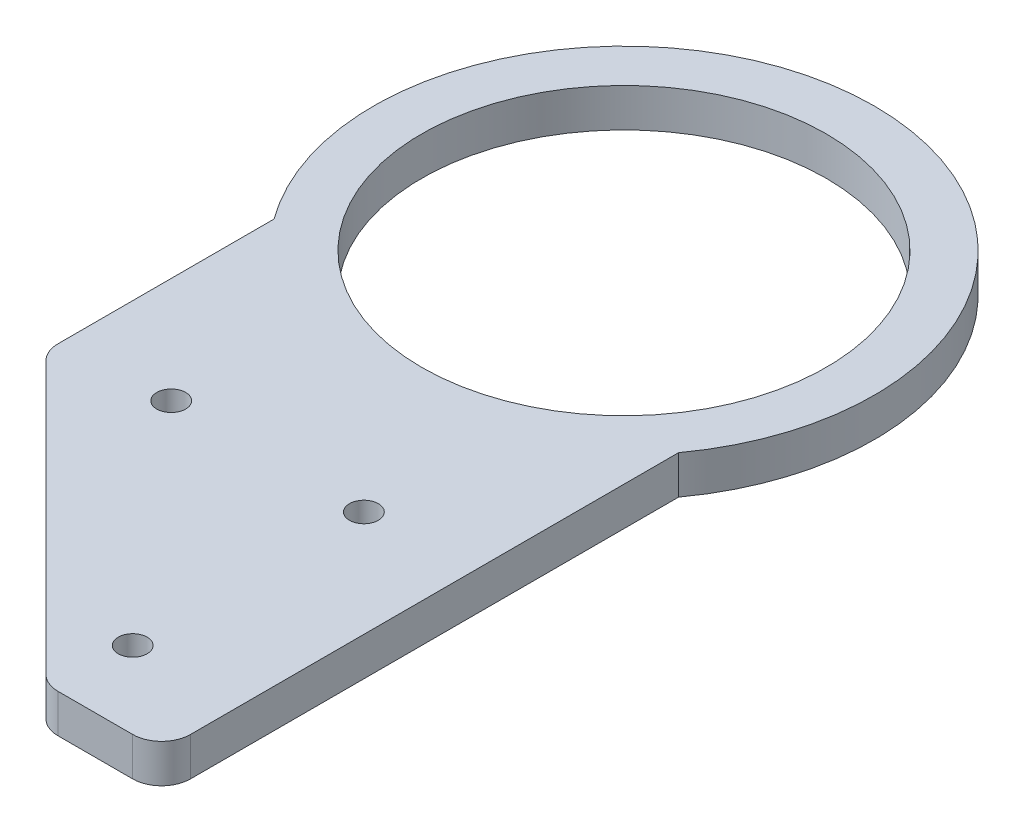
ISO-10303-21;
HEADER;
FILE_DESCRIPTION(('STEP AP214'),'2;1');
FILE_NAME('part.step','',(''),(''),'','','');
FILE_SCHEMA(('AUTOMOTIVE_DESIGN { 1 0 10303 214 1 1 1 1 }'));
ENDSEC;
DATA;
#1=APPLICATION_CONTEXT('core data for automotive mechanical design processes');
#2=APPLICATION_PROTOCOL_DEFINITION('international standard','automotive_design',2000,#1);
#3=PRODUCT_CONTEXT('',#1,'mechanical');
#4=PRODUCT('Part','Part','',(#3));
#5=PRODUCT_RELATED_PRODUCT_CATEGORY('part','',(#4));
#6=PRODUCT_DEFINITION_FORMATION('','',#4);
#7=PRODUCT_DEFINITION_CONTEXT('part definition',#1,'design');
#8=PRODUCT_DEFINITION('design','',#6,#7);
#9=PRODUCT_DEFINITION_SHAPE('','',#8);
#10=(LENGTH_UNIT() NAMED_UNIT(*) SI_UNIT(.MILLI.,.METRE.));
#11=(NAMED_UNIT(*) PLANE_ANGLE_UNIT() SI_UNIT($,.RADIAN.));
#12=(NAMED_UNIT(*) SI_UNIT($,.STERADIAN.) SOLID_ANGLE_UNIT());
#13=UNCERTAINTY_MEASURE_WITH_UNIT(LENGTH_MEASURE(1.E-05),#10,'distance_accuracy_value','');
#14=(GEOMETRIC_REPRESENTATION_CONTEXT(3) GLOBAL_UNCERTAINTY_ASSIGNED_CONTEXT((#13)) GLOBAL_UNIT_ASSIGNED_CONTEXT((#10,
#11,#12)) REPRESENTATION_CONTEXT('',''));
#15=CARTESIAN_POINT('',(0.,0.,0.));
#16=DIRECTION('',(0.,0.,1.));
#17=DIRECTION('',(1.,0.,0.));
#18=AXIS2_PLACEMENT_3D('',#15,#16,#17);
#19=CARTESIAN_POINT('',(80.,0.,0.));
#20=DIRECTION('',(1.,0.,0.));
#21=DIRECTION('',(0.,0.,-1.));
#22=AXIS2_PLACEMENT_3D('',#19,#20,#21);
#23=PLANE('',#22);
#24=DIRECTION('',(0.,0.,-1.));
#25=VECTOR('',#24,1.);
#26=CARTESIAN_POINT('',(80.,0.,0.));
#27=LINE('',#26,#25);
#28=CARTESIAN_POINT('',(80.,0.,-31.2426406871193));
#29=VERTEX_POINT('',#28);
#30=CARTESIAN_POINT('',(80.,0.,-53.6702902832441));
#31=VERTEX_POINT('',#30);
#32=EDGE_CURVE('E143',#29,#31,#27,.T.);
#33=ORIENTED_EDGE('',*,*,#32,.F.);
#34=DIRECTION('',(0.,-1.,0.));
#35=VECTOR('',#34,1.);
#36=CARTESIAN_POINT('',(80.,0.,-31.2426406871193));
#37=LINE('',#36,#35);
#38=CARTESIAN_POINT('',(80.,4.,-31.2426406871193));
#39=VERTEX_POINT('',#38);
#40=EDGE_CURVE('E97',#29,#39,#37,.F.);
#41=ORIENTED_EDGE('',*,*,#40,.T.);
#42=DIRECTION('',(0.,0.,-1.));
#43=VECTOR('',#42,1.);
#44=CARTESIAN_POINT('',(80.,4.,0.));
#45=LINE('',#44,#43);
#46=CARTESIAN_POINT('',(80.,4.,-53.6702902832441));
#47=VERTEX_POINT('',#46);
#48=EDGE_CURVE('E137',#39,#47,#45,.T.);
#49=ORIENTED_EDGE('',*,*,#48,.T.);
#50=DIRECTION('',(0.,1.,0.));
#51=VECTOR('',#50,1.);
#52=CARTESIAN_POINT('',(80.,-66.4239783908741,-53.6702902832441));
#53=LINE('',#52,#51);
#54=EDGE_CURVE('E142',#31,#47,#53,.T.);
#55=ORIENTED_EDGE('',*,*,#54,.F.);
#56=EDGE_LOOP('',(#33,#41,#49,#55));
#57=FACE_BOUND('',#56,.T.);
#58=ADVANCED_FACE('F72',(#57),#23,.F.);
#59=CARTESIAN_POINT('',(0.,4.,0.));
#60=DIRECTION('',(0.,-1.,0.));
#61=DIRECTION('',(0.,0.,-1.));
#62=AXIS2_PLACEMENT_3D('',#59,#60,#61);
#63=PLANE('',#62);
#64=CARTESIAN_POINT('',(101.,4.,-69.));
#65=DIRECTION('',(0.,1.,0.));
#66=DIRECTION('',(0.,0.,1.));
#67=AXIS2_PLACEMENT_3D('',#64,#65,#66);
#68=CIRCLE('',#67,21.);
#69=CARTESIAN_POINT('',(101.,4.,-48.));
#70=VERTEX_POINT('',#69);
#71=EDGE_CURVE('E184',#70,#70,#68,.T.);
#72=ORIENTED_EDGE('',*,*,#71,.F.);
#73=EDGE_LOOP('',(#72));
#74=FACE_BOUND('',#73,.T.);
#75=ORIENTED_EDGE('',*,*,#48,.F.);
#76=CARTESIAN_POINT('',(83.,4.,-31.2426406871193));
#77=DIRECTION('',(0.,-1.,0.));
#78=DIRECTION('',(0.,0.,-1.));
#79=AXIS2_PLACEMENT_3D('',#76,#77,#78);
#80=CIRCLE('',#79,3.);
#81=CARTESIAN_POINT('',(80.8786796564403,4.,-29.1213203435597));
#82=VERTEX_POINT('',#81);
#83=EDGE_CURVE('E85',#39,#82,#80,.F.);
#84=ORIENTED_EDGE('',*,*,#83,.T.);
#85=DIRECTION('',(0.707106781186541,0.,0.707106781186554));
#86=VECTOR('',#85,1.);
#87=CARTESIAN_POINT('',(109.999999999999,4.,0.));
#88=LINE('',#87,#86);
#89=CARTESIAN_POINT('',(109.121320343559,4.,-0.878679656440389));
#90=VERTEX_POINT('',#89);
#91=EDGE_CURVE('E159',#82,#90,#88,.T.);
#92=ORIENTED_EDGE('',*,*,#91,.T.);
#93=CARTESIAN_POINT('',(111.242640687119,4.,-3.00000000000001));
#94=DIRECTION('',(0.,-1.,0.));
#95=DIRECTION('',(0.,0.,-1.));
#96=AXIS2_PLACEMENT_3D('',#93,#94,#95);
#97=CIRCLE('',#96,3.);
#98=CARTESIAN_POINT('',(111.242640687119,4.,0.));
#99=VERTEX_POINT('',#98);
#100=EDGE_CURVE('E87',#90,#99,#97,.F.);
#101=ORIENTED_EDGE('',*,*,#100,.T.);
#102=DIRECTION('',(1.,0.,0.));
#103=VECTOR('',#102,1.);
#104=CARTESIAN_POINT('',(80.,4.,0.));
#105=LINE('',#104,#103);
#106=CARTESIAN_POINT('',(119.,4.,0.));
#107=VERTEX_POINT('',#106);
#108=EDGE_CURVE('E200',#99,#107,#105,.T.);
#109=ORIENTED_EDGE('',*,*,#108,.T.);
#110=CARTESIAN_POINT('',(119.,4.,-3.00000000000001));
#111=DIRECTION('',(0.,-1.,0.));
#112=DIRECTION('',(0.,0.,-1.));
#113=AXIS2_PLACEMENT_3D('',#110,#111,#112);
#114=CIRCLE('',#113,3.);
#115=CARTESIAN_POINT('',(122.,4.,-3.00000000000001));
#116=VERTEX_POINT('',#115);
#117=EDGE_CURVE('E197',#107,#116,#114,.F.);
#118=ORIENTED_EDGE('',*,*,#117,.T.);
#119=DIRECTION('',(0.,0.,1.));
#120=VECTOR('',#119,1.);
#121=CARTESIAN_POINT('',(122.,4.,0.));
#122=LINE('',#121,#120);
#123=CARTESIAN_POINT('',(122.,4.,-53.6702902832441));
#124=VERTEX_POINT('',#123);
#125=EDGE_CURVE('E157',#124,#116,#122,.T.);
#126=ORIENTED_EDGE('',*,*,#125,.F.);
#127=CARTESIAN_POINT('',(101.,4.,-69.));
#128=DIRECTION('',(0.,1.,0.));
#129=DIRECTION('',(0.,0.,1.));
#130=AXIS2_PLACEMENT_3D('',#127,#128,#129);
#131=CIRCLE('',#130,26.);
#132=EDGE_CURVE('E153',#124,#47,#131,.T.);
#133=ORIENTED_EDGE('',*,*,#132,.T.);
#134=EDGE_LOOP('',(#75,#84,#92,#101,#109,#118,#126,#133));
#135=FACE_BOUND('',#134,.T.);
#136=CARTESIAN_POINT('',(91.,4.,-32.));
#137=DIRECTION('',(0.,1.,0.));
#138=DIRECTION('',(0.,0.,1.));
#139=AXIS2_PLACEMENT_3D('',#136,#137,#138);
#140=CIRCLE('',#139,1.5);
#141=CARTESIAN_POINT('',(91.,4.,-30.5));
#142=VERTEX_POINT('',#141);
#143=EDGE_CURVE('E173',#142,#142,#140,.T.);
#144=ORIENTED_EDGE('',*,*,#143,.F.);
#145=EDGE_LOOP('',(#144));
#146=FACE_BOUND('',#145,.T.);
#147=CARTESIAN_POINT('',(111.,4.,-8.));
#148=DIRECTION('',(0.,1.,0.));
#149=DIRECTION('',(0.,0.,1.));
#150=AXIS2_PLACEMENT_3D('',#147,#148,#149);
#151=CIRCLE('',#150,1.5);
#152=CARTESIAN_POINT('',(111.,4.,-6.5));
#153=VERTEX_POINT('',#152);
#154=EDGE_CURVE('E180',#153,#153,#151,.T.);
#155=ORIENTED_EDGE('',*,*,#154,.F.);
#156=EDGE_LOOP('',(#155));
#157=FACE_BOUND('',#156,.T.);
#158=CARTESIAN_POINT('',(111.,4.,-32.));
#159=DIRECTION('',(0.,1.,0.));
#160=DIRECTION('',(0.,0.,1.));
#161=AXIS2_PLACEMENT_3D('',#158,#159,#160);
#162=CIRCLE('',#161,1.5);
#163=CARTESIAN_POINT('',(111.,4.,-30.5));
#164=VERTEX_POINT('',#163);
#165=EDGE_CURVE('E167',#164,#164,#162,.T.);
#166=ORIENTED_EDGE('',*,*,#165,.F.);
#167=EDGE_LOOP('',(#166));
#168=FACE_BOUND('',#167,.T.);
#169=ADVANCED_FACE('F158',(#74,#135,#146,#157,#168),#63,.F.);
#170=CARTESIAN_POINT('',(0.,0.,0.));
#171=DIRECTION('',(0.,-1.,0.));
#172=DIRECTION('',(0.,0.,-1.));
#173=AXIS2_PLACEMENT_3D('',#170,#171,#172);
#174=PLANE('',#173);
#175=DIRECTION('',(0.707106781186541,0.,0.707106781186554));
#176=VECTOR('',#175,1.);
#177=CARTESIAN_POINT('',(109.999999999999,0.,0.));
#178=LINE('',#177,#176);
#179=CARTESIAN_POINT('',(80.8786796564403,0.,-29.1213203435597));
#180=VERTEX_POINT('',#179);
#181=CARTESIAN_POINT('',(109.121320343559,0.,-0.878679656440389));
#182=VERTEX_POINT('',#181);
#183=EDGE_CURVE('E161',#180,#182,#178,.T.);
#184=ORIENTED_EDGE('',*,*,#183,.F.);
#185=CARTESIAN_POINT('',(83.,0.,-31.2426406871193));
#186=DIRECTION('',(0.,-1.,0.));
#187=DIRECTION('',(0.,0.,-1.));
#188=AXIS2_PLACEMENT_3D('',#185,#186,#187);
#189=CIRCLE('',#188,3.);
#190=EDGE_CURVE('E216',#180,#29,#189,.T.);
#191=ORIENTED_EDGE('',*,*,#190,.T.);
#192=ORIENTED_EDGE('',*,*,#32,.T.);
#193=CARTESIAN_POINT('',(101.,0.,-69.));
#194=DIRECTION('',(0.,-1.,0.));
#195=DIRECTION('',(0.,0.,-1.));
#196=AXIS2_PLACEMENT_3D('',#193,#194,#195);
#197=CIRCLE('',#196,26.);
#198=CARTESIAN_POINT('',(122.,0.,-53.6702902832441));
#199=VERTEX_POINT('',#198);
#200=EDGE_CURVE('E151',#199,#31,#197,.F.);
#201=ORIENTED_EDGE('',*,*,#200,.F.);
#202=DIRECTION('',(0.,0.,1.));
#203=VECTOR('',#202,1.);
#204=CARTESIAN_POINT('',(122.,0.,0.));
#205=LINE('',#204,#203);
#206=CARTESIAN_POINT('',(122.,0.,-3.00000000000001));
#207=VERTEX_POINT('',#206);
#208=EDGE_CURVE('E195',#199,#207,#205,.T.);
#209=ORIENTED_EDGE('',*,*,#208,.T.);
#210=CARTESIAN_POINT('',(119.,0.,-3.00000000000001));
#211=DIRECTION('',(0.,-1.,0.));
#212=DIRECTION('',(0.,0.,-1.));
#213=AXIS2_PLACEMENT_3D('',#210,#211,#212);
#214=CIRCLE('',#213,3.);
#215=CARTESIAN_POINT('',(119.,0.,0.));
#216=VERTEX_POINT('',#215);
#217=EDGE_CURVE('E205',#207,#216,#214,.T.);
#218=ORIENTED_EDGE('',*,*,#217,.T.);
#219=DIRECTION('',(1.,0.,0.));
#220=VECTOR('',#219,1.);
#221=CARTESIAN_POINT('',(80.,0.,0.));
#222=LINE('',#221,#220);
#223=CARTESIAN_POINT('',(111.242640687119,0.,0.));
#224=VERTEX_POINT('',#223);
#225=EDGE_CURVE('E191',#224,#216,#222,.T.);
#226=ORIENTED_EDGE('',*,*,#225,.F.);
#227=CARTESIAN_POINT('',(111.242640687119,0.,-3.00000000000001));
#228=DIRECTION('',(0.,-1.,0.));
#229=DIRECTION('',(0.,0.,-1.));
#230=AXIS2_PLACEMENT_3D('',#227,#228,#229);
#231=CIRCLE('',#230,3.);
#232=EDGE_CURVE('E218',#224,#182,#231,.T.);
#233=ORIENTED_EDGE('',*,*,#232,.T.);
#234=EDGE_LOOP('',(#184,#191,#192,#201,#209,#218,#226,#233));
#235=FACE_BOUND('',#234,.T.);
#236=CARTESIAN_POINT('',(101.,0.,-69.));
#237=DIRECTION('',(0.,-1.,0.));
#238=DIRECTION('',(0.,0.,-1.));
#239=AXIS2_PLACEMENT_3D('',#236,#237,#238);
#240=CIRCLE('',#239,21.);
#241=CARTESIAN_POINT('',(101.,0.,-90.));
#242=VERTEX_POINT('',#241);
#243=EDGE_CURVE('E186',#242,#242,#240,.F.);
#244=ORIENTED_EDGE('',*,*,#243,.T.);
#245=EDGE_LOOP('',(#244));
#246=FACE_BOUND('',#245,.T.);
#247=CARTESIAN_POINT('',(91.,0.,-32.));
#248=DIRECTION('',(0.,1.,0.));
#249=DIRECTION('',(0.,0.,1.));
#250=AXIS2_PLACEMENT_3D('',#247,#248,#249);
#251=CIRCLE('',#250,1.5);
#252=CARTESIAN_POINT('',(91.,0.,-30.5));
#253=VERTEX_POINT('',#252);
#254=EDGE_CURVE('E185',#253,#253,#251,.T.);
#255=ORIENTED_EDGE('',*,*,#254,.T.);
#256=EDGE_LOOP('',(#255));
#257=FACE_BOUND('',#256,.T.);
#258=CARTESIAN_POINT('',(111.,0.,-8.));
#259=DIRECTION('',(0.,1.,0.));
#260=DIRECTION('',(0.,0.,1.));
#261=AXIS2_PLACEMENT_3D('',#258,#259,#260);
#262=CIRCLE('',#261,1.5);
#263=CARTESIAN_POINT('',(111.,0.,-6.5));
#264=VERTEX_POINT('',#263);
#265=EDGE_CURVE('E166',#264,#264,#262,.T.);
#266=ORIENTED_EDGE('',*,*,#265,.T.);
#267=EDGE_LOOP('',(#266));
#268=FACE_BOUND('',#267,.T.);
#269=CARTESIAN_POINT('',(111.,0.,-32.));
#270=DIRECTION('',(0.,1.,0.));
#271=DIRECTION('',(0.,0.,1.));
#272=AXIS2_PLACEMENT_3D('',#269,#270,#271);
#273=CIRCLE('',#272,1.5);
#274=CARTESIAN_POINT('',(111.,0.,-30.5));
#275=VERTEX_POINT('',#274);
#276=EDGE_CURVE('E172',#275,#275,#273,.T.);
#277=ORIENTED_EDGE('',*,*,#276,.T.);
#278=EDGE_LOOP('',(#277));
#279=FACE_BOUND('',#278,.T.);
#280=ADVANCED_FACE('F233',(#235,#246,#257,#268,#279),#174,.T.);
#281=CARTESIAN_POINT('',(80.,4.,0.));
#282=DIRECTION('',(0.,0.,-1.));
#283=DIRECTION('',(-1.,0.,0.));
#284=AXIS2_PLACEMENT_3D('',#281,#282,#283);
#285=PLANE('',#284);
#286=ORIENTED_EDGE('',*,*,#108,.F.);
#287=DIRECTION('',(0.,-1.,0.));
#288=VECTOR('',#287,1.);
#289=CARTESIAN_POINT('',(111.242640687119,4.,0.));
#290=LINE('',#289,#288);
#291=EDGE_CURVE('E13',#99,#224,#290,.T.);
#292=ORIENTED_EDGE('',*,*,#291,.T.);
#293=ORIENTED_EDGE('',*,*,#225,.T.);
#294=DIRECTION('',(0.,1.,0.));
#295=VECTOR('',#294,1.);
#296=CARTESIAN_POINT('',(119.,4.,0.));
#297=LINE('',#296,#295);
#298=EDGE_CURVE('E204',#216,#107,#297,.T.);
#299=ORIENTED_EDGE('',*,*,#298,.T.);
#300=EDGE_LOOP('',(#286,#292,#293,#299));
#301=FACE_BOUND('',#300,.T.);
#302=ADVANCED_FACE('F240',(#301),#285,.F.);
#303=CARTESIAN_POINT('',(101.,-73.2393336944022,-69.));
#304=DIRECTION('',(0.,1.,0.));
#305=DIRECTION('',(0.,0.,1.));
#306=AXIS2_PLACEMENT_3D('',#303,#304,#305);
#307=CYLINDRICAL_SURFACE('',#306,21.);
#308=ORIENTED_EDGE('',*,*,#71,.T.);
#309=EDGE_LOOP('',(#308));
#310=FACE_BOUND('',#309,.T.);
#311=ORIENTED_EDGE('',*,*,#243,.F.);
#312=EDGE_LOOP('',(#311));
#313=FACE_BOUND('',#312,.T.);
#314=ADVANCED_FACE('F248',(#310,#313),#307,.F.);
#315=CARTESIAN_POINT('',(122.,-73.2393336944022,0.));
#316=DIRECTION('',(-1.,0.,0.));
#317=DIRECTION('',(0.,0.,1.));
#318=AXIS2_PLACEMENT_3D('',#315,#316,#317);
#319=PLANE('',#318);
#320=ORIENTED_EDGE('',*,*,#208,.F.);
#321=DIRECTION('',(0.,1.,0.));
#322=VECTOR('',#321,1.);
#323=CARTESIAN_POINT('',(122.,-66.4239783908741,-53.6702902832441));
#324=LINE('',#323,#322);
#325=EDGE_CURVE('E147',#199,#124,#324,.T.);
#326=ORIENTED_EDGE('',*,*,#325,.T.);
#327=ORIENTED_EDGE('',*,*,#125,.T.);
#328=DIRECTION('',(0.,1.,0.));
#329=VECTOR('',#328,1.);
#330=CARTESIAN_POINT('',(122.,-73.2393336944022,-3.00000000000001));
#331=LINE('',#330,#329);
#332=EDGE_CURVE('E206',#116,#207,#331,.F.);
#333=ORIENTED_EDGE('',*,*,#332,.T.);
#334=EDGE_LOOP('',(#320,#326,#327,#333));
#335=FACE_BOUND('',#334,.T.);
#336=ADVANCED_FACE('F246',(#335),#319,.F.);
#337=CARTESIAN_POINT('',(91.,0.,-32.));
#338=DIRECTION('',(0.,1.,0.));
#339=DIRECTION('',(0.,0.,1.));
#340=AXIS2_PLACEMENT_3D('',#337,#338,#339);
#341=CYLINDRICAL_SURFACE('',#340,1.5);
#342=ORIENTED_EDGE('',*,*,#254,.F.);
#343=EDGE_LOOP('',(#342));
#344=FACE_BOUND('',#343,.T.);
#345=ORIENTED_EDGE('',*,*,#143,.T.);
#346=EDGE_LOOP('',(#345));
#347=FACE_BOUND('',#346,.T.);
#348=ADVANCED_FACE('F247',(#344,#347),#341,.F.);
#349=CARTESIAN_POINT('',(111.,0.,-8.));
#350=DIRECTION('',(0.,1.,0.));
#351=DIRECTION('',(0.,0.,1.));
#352=AXIS2_PLACEMENT_3D('',#349,#350,#351);
#353=CYLINDRICAL_SURFACE('',#352,1.5);
#354=ORIENTED_EDGE('',*,*,#265,.F.);
#355=EDGE_LOOP('',(#354));
#356=FACE_BOUND('',#355,.T.);
#357=ORIENTED_EDGE('',*,*,#154,.T.);
#358=EDGE_LOOP('',(#357));
#359=FACE_BOUND('',#358,.T.);
#360=ADVANCED_FACE('F257',(#356,#359),#353,.F.);
#361=CARTESIAN_POINT('',(111.,0.,-32.));
#362=DIRECTION('',(0.,1.,0.));
#363=DIRECTION('',(0.,0.,1.));
#364=AXIS2_PLACEMENT_3D('',#361,#362,#363);
#365=CYLINDRICAL_SURFACE('',#364,1.5);
#366=ORIENTED_EDGE('',*,*,#276,.F.);
#367=EDGE_LOOP('',(#366));
#368=FACE_BOUND('',#367,.T.);
#369=ORIENTED_EDGE('',*,*,#165,.T.);
#370=EDGE_LOOP('',(#369));
#371=FACE_BOUND('',#370,.T.);
#372=ADVANCED_FACE('F272',(#368,#371),#365,.F.);
#373=CARTESIAN_POINT('',(119.,4.,-3.00000000000001));
#374=DIRECTION('',(0.,1.,0.));
#375=DIRECTION('',(0.,0.,1.));
#376=AXIS2_PLACEMENT_3D('',#373,#374,#375);
#377=CYLINDRICAL_SURFACE('',#376,3.);
#378=ORIENTED_EDGE('',*,*,#217,.F.);
#379=ORIENTED_EDGE('',*,*,#332,.F.);
#380=ORIENTED_EDGE('',*,*,#117,.F.);
#381=ORIENTED_EDGE('',*,*,#298,.F.);
#382=EDGE_LOOP('',(#378,#379,#380,#381));
#383=FACE_BOUND('',#382,.T.);
#384=ADVANCED_FACE('F242',(#383),#377,.T.);
#385=CARTESIAN_POINT('',(101.,-66.4239783908741,-69.));
#386=DIRECTION('',(0.,1.,0.));
#387=DIRECTION('',(0.,0.,1.));
#388=AXIS2_PLACEMENT_3D('',#385,#386,#387);
#389=CYLINDRICAL_SURFACE('',#388,26.);
#390=ORIENTED_EDGE('',*,*,#325,.F.);
#391=ORIENTED_EDGE('',*,*,#200,.T.);
#392=ORIENTED_EDGE('',*,*,#54,.T.);
#393=ORIENTED_EDGE('',*,*,#132,.F.);
#394=EDGE_LOOP('',(#390,#391,#392,#393));
#395=FACE_BOUND('',#394,.T.);
#396=ADVANCED_FACE('F148',(#395),#389,.T.);
#397=CARTESIAN_POINT('',(109.999999999999,4.,0.));
#398=DIRECTION('',(0.707106781186554,0.,-0.707106781186541));
#399=DIRECTION('',(-0.707106781186541,0.,-0.707106781186554));
#400=AXIS2_PLACEMENT_3D('',#397,#398,#399);
#401=PLANE('',#400);
#402=ORIENTED_EDGE('',*,*,#91,.F.);
#403=DIRECTION('',(0.,-1.,0.));
#404=VECTOR('',#403,1.);
#405=CARTESIAN_POINT('',(80.8786796564403,4.,-29.1213203435597));
#406=LINE('',#405,#404);
#407=EDGE_CURVE('E214',#82,#180,#406,.T.);
#408=ORIENTED_EDGE('',*,*,#407,.T.);
#409=ORIENTED_EDGE('',*,*,#183,.T.);
#410=DIRECTION('',(0.,-1.,0.));
#411=VECTOR('',#410,1.);
#412=CARTESIAN_POINT('',(109.121320343559,4.,-0.878679656440388));
#413=LINE('',#412,#411);
#414=EDGE_CURVE('E212',#182,#90,#413,.F.);
#415=ORIENTED_EDGE('',*,*,#414,.T.);
#416=EDGE_LOOP('',(#402,#408,#409,#415));
#417=FACE_BOUND('',#416,.T.);
#418=ADVANCED_FACE('F224',(#417),#401,.F.);
#419=CARTESIAN_POINT('',(83.,4.,-31.2426406871193));
#420=DIRECTION('',(0.,-1.,0.));
#421=DIRECTION('',(0.,0.,-1.));
#422=AXIS2_PLACEMENT_3D('',#419,#420,#421);
#423=CYLINDRICAL_SURFACE('',#422,3.);
#424=ORIENTED_EDGE('',*,*,#83,.F.);
#425=ORIENTED_EDGE('',*,*,#40,.F.);
#426=ORIENTED_EDGE('',*,*,#190,.F.);
#427=ORIENTED_EDGE('',*,*,#407,.F.);
#428=EDGE_LOOP('',(#424,#425,#426,#427));
#429=FACE_BOUND('',#428,.T.);
#430=ADVANCED_FACE('F230',(#429),#423,.T.);
#431=CARTESIAN_POINT('',(111.242640687119,4.,-3.00000000000001));
#432=DIRECTION('',(0.,-1.,0.));
#433=DIRECTION('',(0.,0.,-1.));
#434=AXIS2_PLACEMENT_3D('',#431,#432,#433);
#435=CYLINDRICAL_SURFACE('',#434,3.);
#436=ORIENTED_EDGE('',*,*,#100,.F.);
#437=ORIENTED_EDGE('',*,*,#414,.F.);
#438=ORIENTED_EDGE('',*,*,#232,.F.);
#439=ORIENTED_EDGE('',*,*,#291,.F.);
#440=EDGE_LOOP('',(#436,#437,#438,#439));
#441=FACE_BOUND('',#440,.T.);
#442=ADVANCED_FACE('F77',(#441),#435,.T.);
#443=CLOSED_SHELL('',(#58,#169,#280,#302,#314,#336,#348,#360,#372,#384,#396,#418,#430,#442));
#444=MANIFOLD_SOLID_BREP('B2',#443);
#445=ADVANCED_BREP_SHAPE_REPRESENTATION('',(#18,#444),#14);
#446=SHAPE_DEFINITION_REPRESENTATION(#9,#445);
ENDSEC;
END-ISO-10303-21;
